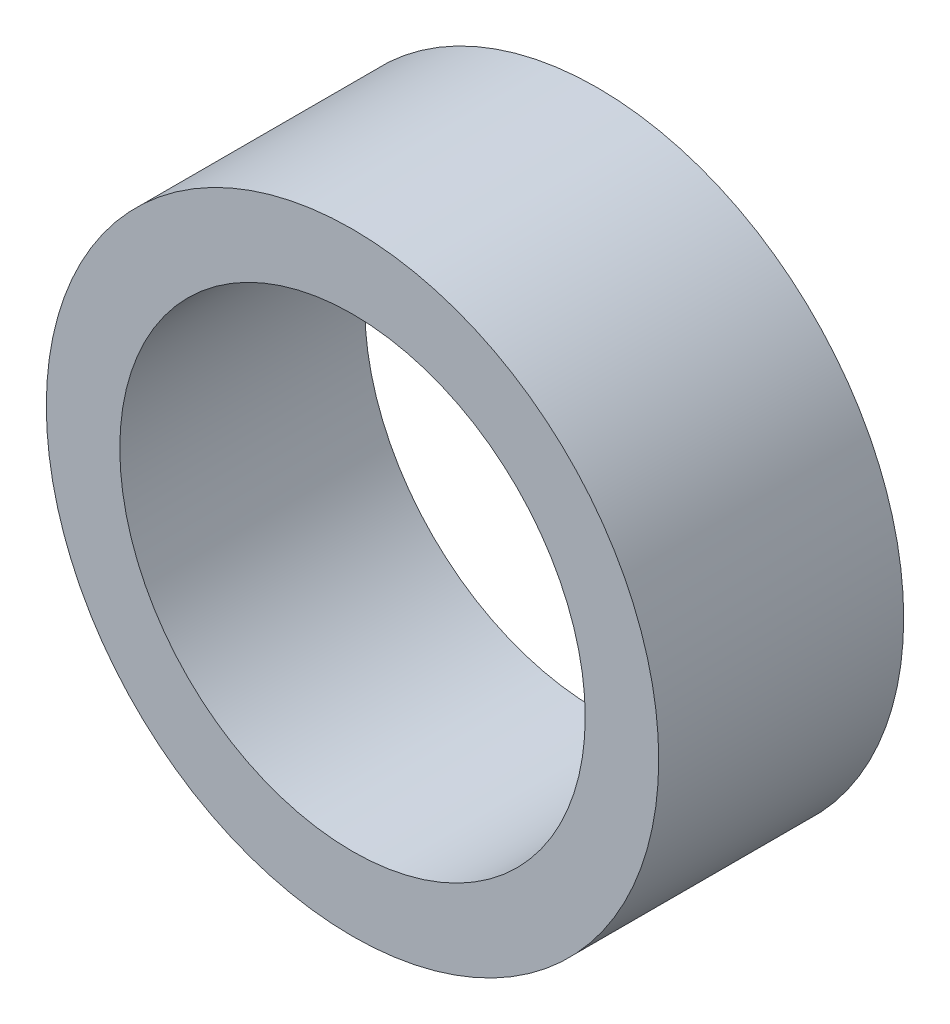
ISO-10303-21;
HEADER;
FILE_DESCRIPTION(('STEP AP214'),'2;1');
FILE_NAME('part.step','',(''),(''),'','','');
FILE_SCHEMA(('AUTOMOTIVE_DESIGN { 1 0 10303 214 1 1 1 1 }'));
ENDSEC;
DATA;
#1=APPLICATION_CONTEXT('core data for automotive mechanical design processes');
#2=APPLICATION_PROTOCOL_DEFINITION('international standard','automotive_design',2000,#1);
#3=PRODUCT_CONTEXT('',#1,'mechanical');
#4=PRODUCT('Part','Part','',(#3));
#5=PRODUCT_RELATED_PRODUCT_CATEGORY('part','',(#4));
#6=PRODUCT_DEFINITION_FORMATION('','',#4);
#7=PRODUCT_DEFINITION_CONTEXT('part definition',#1,'design');
#8=PRODUCT_DEFINITION('design','',#6,#7);
#9=PRODUCT_DEFINITION_SHAPE('','',#8);
#10=(LENGTH_UNIT() NAMED_UNIT(*) SI_UNIT(.MILLI.,.METRE.));
#11=(NAMED_UNIT(*) PLANE_ANGLE_UNIT() SI_UNIT($,.RADIAN.));
#12=(NAMED_UNIT(*) SI_UNIT($,.STERADIAN.) SOLID_ANGLE_UNIT());
#13=UNCERTAINTY_MEASURE_WITH_UNIT(LENGTH_MEASURE(1.E-05),#10,'distance_accuracy_value','');
#14=(GEOMETRIC_REPRESENTATION_CONTEXT(3) GLOBAL_UNCERTAINTY_ASSIGNED_CONTEXT((#13)) GLOBAL_UNIT_ASSIGNED_CONTEXT((#10,
#11,#12)) REPRESENTATION_CONTEXT('',''));
#15=CARTESIAN_POINT('',(0.,0.,0.));
#16=DIRECTION('',(0.,0.,1.));
#17=DIRECTION('',(1.,0.,0.));
#18=AXIS2_PLACEMENT_3D('',#15,#16,#17);
#19=CARTESIAN_POINT('',(0.,0.,4.));
#20=DIRECTION('',(0.,0.,1.));
#21=DIRECTION('',(1.,0.,0.));
#22=AXIS2_PLACEMENT_3D('',#19,#20,#21);
#23=PLANE('',#22);
#24=CARTESIAN_POINT('',(0.,0.,4.));
#25=DIRECTION('',(0.,0.,1.));
#26=DIRECTION('',(1.,0.,0.));
#27=AXIS2_PLACEMENT_3D('',#24,#25,#26);
#28=CIRCLE('',#27,10.);
#29=CARTESIAN_POINT('',(10.,0.,4.));
#30=VERTEX_POINT('',#29);
#31=EDGE_CURVE('E10',#30,#30,#28,.T.);
#32=ORIENTED_EDGE('',*,*,#31,.T.);
#33=EDGE_LOOP('',(#32));
#34=FACE_BOUND('',#33,.T.);
#35=CARTESIAN_POINT('',(0.,0.,4.));
#36=DIRECTION('',(0.,0.,1.));
#37=DIRECTION('',(1.,0.,0.));
#38=AXIS2_PLACEMENT_3D('',#35,#36,#37);
#39=CIRCLE('',#38,7.6);
#40=CARTESIAN_POINT('',(7.6,0.,4.));
#41=VERTEX_POINT('',#40);
#42=EDGE_CURVE('E54',#41,#41,#39,.T.);
#43=ORIENTED_EDGE('',*,*,#42,.F.);
#44=EDGE_LOOP('',(#43));
#45=FACE_BOUND('',#44,.T.);
#46=ADVANCED_FACE('F41',(#34,#45),#23,.T.);
#47=CARTESIAN_POINT('',(0.,0.,-4.));
#48=DIRECTION('',(0.,0.,1.));
#49=DIRECTION('',(1.,0.,0.));
#50=AXIS2_PLACEMENT_3D('',#47,#48,#49);
#51=PLANE('',#50);
#52=CARTESIAN_POINT('',(0.,0.,-4.));
#53=DIRECTION('',(0.,0.,1.));
#54=DIRECTION('',(1.,0.,0.));
#55=AXIS2_PLACEMENT_3D('',#52,#53,#54);
#56=CIRCLE('',#55,10.);
#57=CARTESIAN_POINT('',(10.,0.,-4.));
#58=VERTEX_POINT('',#57);
#59=EDGE_CURVE('E45',#58,#58,#56,.T.);
#60=ORIENTED_EDGE('',*,*,#59,.F.);
#61=EDGE_LOOP('',(#60));
#62=FACE_BOUND('',#61,.T.);
#63=CARTESIAN_POINT('',(0.,0.,-4.));
#64=DIRECTION('',(0.,0.,1.));
#65=DIRECTION('',(1.,0.,0.));
#66=AXIS2_PLACEMENT_3D('',#63,#64,#65);
#67=CIRCLE('',#66,7.6);
#68=CARTESIAN_POINT('',(7.6,0.,-4.));
#69=VERTEX_POINT('',#68);
#70=EDGE_CURVE('E56',#69,#69,#67,.T.);
#71=ORIENTED_EDGE('',*,*,#70,.T.);
#72=EDGE_LOOP('',(#71));
#73=FACE_BOUND('',#72,.T.);
#74=ADVANCED_FACE('F68',(#62,#73),#51,.F.);
#75=CARTESIAN_POINT('',(0.,0.,4.));
#76=DIRECTION('',(0.,0.,-1.));
#77=DIRECTION('',(-1.,0.,0.));
#78=AXIS2_PLACEMENT_3D('',#75,#76,#77);
#79=CYLINDRICAL_SURFACE('',#78,10.);
#80=ORIENTED_EDGE('',*,*,#31,.F.);
#81=EDGE_LOOP('',(#80));
#82=FACE_BOUND('',#81,.T.);
#83=ORIENTED_EDGE('',*,*,#59,.T.);
#84=EDGE_LOOP('',(#83));
#85=FACE_BOUND('',#84,.T.);
#86=ADVANCED_FACE('F43',(#82,#85),#79,.T.);
#87=CARTESIAN_POINT('',(0.,0.,4.));
#88=DIRECTION('',(0.,0.,-1.));
#89=DIRECTION('',(-1.,0.,0.));
#90=AXIS2_PLACEMENT_3D('',#87,#88,#89);
#91=CYLINDRICAL_SURFACE('',#90,7.6);
#92=ORIENTED_EDGE('',*,*,#42,.T.);
#93=EDGE_LOOP('',(#92));
#94=FACE_BOUND('',#93,.T.);
#95=ORIENTED_EDGE('',*,*,#70,.F.);
#96=EDGE_LOOP('',(#95));
#97=FACE_BOUND('',#96,.T.);
#98=ADVANCED_FACE('F64',(#94,#97),#91,.F.);
#99=CLOSED_SHELL('',(#46,#74,#86,#98));
#100=MANIFOLD_SOLID_BREP('B2',#99);
#101=ADVANCED_BREP_SHAPE_REPRESENTATION('',(#18,#100),#14);
#102=SHAPE_DEFINITION_REPRESENTATION(#9,#101);
ENDSEC;
END-ISO-10303-21;
